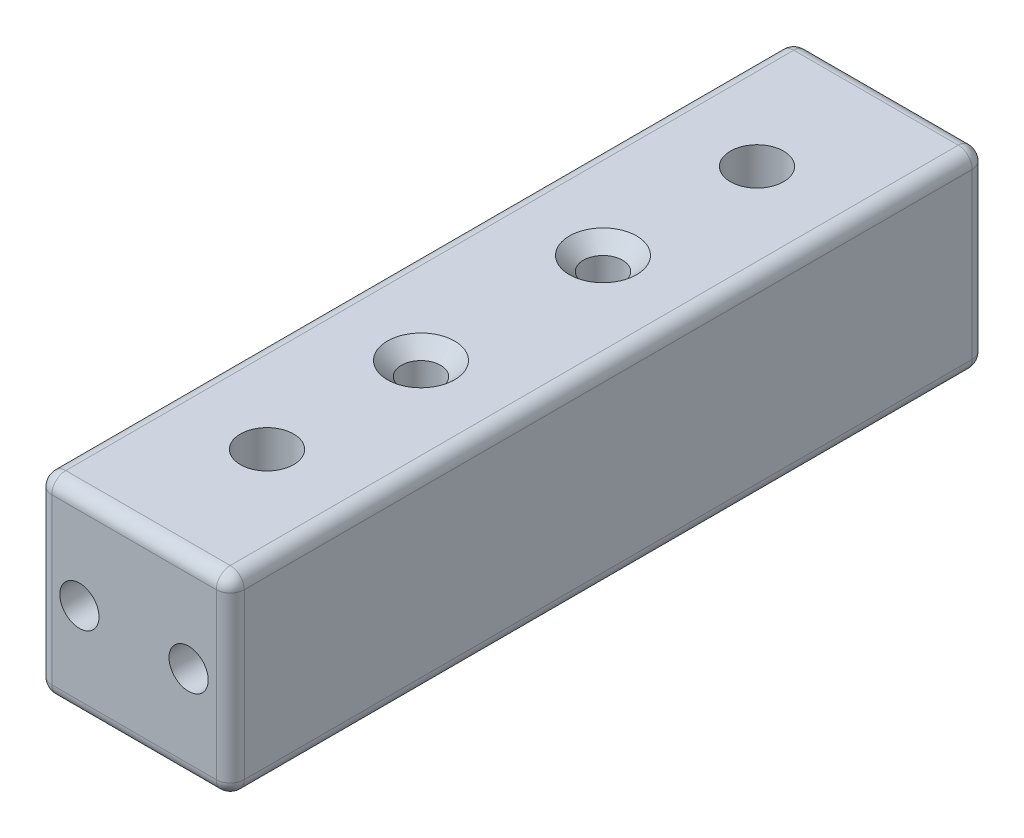
ISO-10303-21;
HEADER;
FILE_DESCRIPTION(('STEP AP214'),'2;1');
FILE_NAME('part.step','',(''),(''),'','','');
FILE_SCHEMA(('AUTOMOTIVE_DESIGN { 1 0 10303 214 1 1 1 1 }'));
ENDSEC;
DATA;
#1=APPLICATION_CONTEXT('core data for automotive mechanical design processes');
#2=APPLICATION_PROTOCOL_DEFINITION('international standard','automotive_design',2000,#1);
#3=PRODUCT_CONTEXT('',#1,'mechanical');
#4=PRODUCT('Part','Part','',(#3));
#5=PRODUCT_RELATED_PRODUCT_CATEGORY('part','',(#4));
#6=PRODUCT_DEFINITION_FORMATION('','',#4);
#7=PRODUCT_DEFINITION_CONTEXT('part definition',#1,'design');
#8=PRODUCT_DEFINITION('design','',#6,#7);
#9=PRODUCT_DEFINITION_SHAPE('','',#8);
#10=(LENGTH_UNIT() NAMED_UNIT(*) SI_UNIT(.MILLI.,.METRE.));
#11=(NAMED_UNIT(*) PLANE_ANGLE_UNIT() SI_UNIT($,.RADIAN.));
#12=(NAMED_UNIT(*) SI_UNIT($,.STERADIAN.) SOLID_ANGLE_UNIT());
#13=UNCERTAINTY_MEASURE_WITH_UNIT(LENGTH_MEASURE(1.E-05),#10,'distance_accuracy_value','');
#14=(GEOMETRIC_REPRESENTATION_CONTEXT(3) GLOBAL_UNCERTAINTY_ASSIGNED_CONTEXT((#13)) GLOBAL_UNIT_ASSIGNED_CONTEXT((#10,
#11,#12)) REPRESENTATION_CONTEXT('',''));
#15=CARTESIAN_POINT('',(0.,0.,0.));
#16=DIRECTION('',(0.,0.,1.));
#17=DIRECTION('',(1.,0.,0.));
#18=AXIS2_PLACEMENT_3D('',#15,#16,#17);
#19=CARTESIAN_POINT('',(6.875,-6.875,54.));
#20=DIRECTION('',(-1.,0.,0.));
#21=DIRECTION('',(0.,0.,1.));
#22=AXIS2_PLACEMENT_3D('',#19,#20,#21);
#23=PLANE('',#22);
#24=DIRECTION('',(0.,1.,0.));
#25=VECTOR('',#24,1.);
#26=CARTESIAN_POINT('',(6.875,-6.875,53.));
#27=LINE('',#26,#25);
#28=CARTESIAN_POINT('',(6.875,5.875,53.));
#29=VERTEX_POINT('',#28);
#30=CARTESIAN_POINT('',(6.875,-5.875,53.));
#31=VERTEX_POINT('',#30);
#32=EDGE_CURVE('E252',#29,#31,#27,.F.);
#33=ORIENTED_EDGE('',*,*,#32,.T.);
#34=DIRECTION('',(0.,0.,-1.));
#35=VECTOR('',#34,1.);
#36=CARTESIAN_POINT('',(6.875,-5.875,54.));
#37=LINE('',#36,#35);
#38=CARTESIAN_POINT('',(6.875,-5.875,1.));
#39=VERTEX_POINT('',#38);
#40=EDGE_CURVE('E259',#31,#39,#37,.T.);
#41=ORIENTED_EDGE('',*,*,#40,.T.);
#42=DIRECTION('',(0.,1.,0.));
#43=VECTOR('',#42,1.);
#44=CARTESIAN_POINT('',(6.875,6.875,1.));
#45=LINE('',#44,#43);
#46=CARTESIAN_POINT('',(6.875,5.875,1.));
#47=VERTEX_POINT('',#46);
#48=EDGE_CURVE('E255',#39,#47,#45,.T.);
#49=ORIENTED_EDGE('',*,*,#48,.T.);
#50=DIRECTION('',(0.,0.,-1.));
#51=VECTOR('',#50,1.);
#52=CARTESIAN_POINT('',(6.875,5.875,54.));
#53=LINE('',#52,#51);
#54=EDGE_CURVE('E249',#47,#29,#53,.F.);
#55=ORIENTED_EDGE('',*,*,#54,.T.);
#56=EDGE_LOOP('',(#33,#41,#49,#55));
#57=FACE_BOUND('',#56,.T.);
#58=ADVANCED_FACE('F50',(#57),#23,.F.);
#59=CARTESIAN_POINT('',(-6.875,6.875,54.));
#60=DIRECTION('',(0.,-1.,0.));
#61=DIRECTION('',(0.,0.,-1.));
#62=AXIS2_PLACEMENT_3D('',#59,#60,#61);
#63=PLANE('',#62);
#64=CARTESIAN_POINT('',(0.,6.875,33.5));
#65=DIRECTION('',(0.,-1.,0.));
#66=DIRECTION('',(0.,0.,-1.));
#67=AXIS2_PLACEMENT_3D('',#64,#65,#66);
#68=CIRCLE('',#67,2.4);
#69=CARTESIAN_POINT('',(0.,6.875,31.1));
#70=VERTEX_POINT('',#69);
#71=EDGE_CURVE('E11',#70,#70,#68,.T.);
#72=ORIENTED_EDGE('',*,*,#71,.T.);
#73=EDGE_LOOP('',(#72));
#74=FACE_BOUND('',#73,.T.);
#75=CARTESIAN_POINT('',(0.,6.875,20.5));
#76=DIRECTION('',(0.,-1.,0.));
#77=DIRECTION('',(0.,0.,-1.));
#78=AXIS2_PLACEMENT_3D('',#75,#76,#77);
#79=CIRCLE('',#78,2.4);
#80=CARTESIAN_POINT('',(0.,6.875,18.1));
#81=VERTEX_POINT('',#80);
#82=EDGE_CURVE('E60',#81,#81,#79,.T.);
#83=ORIENTED_EDGE('',*,*,#82,.T.);
#84=EDGE_LOOP('',(#83));
#85=FACE_BOUND('',#84,.T.);
#86=DIRECTION('',(-1.,0.,0.));
#87=VECTOR('',#86,1.);
#88=CARTESIAN_POINT('',(-6.875,6.875,53.));
#89=LINE('',#88,#87);
#90=CARTESIAN_POINT('',(-5.875,6.875,53.));
#91=VERTEX_POINT('',#90);
#92=CARTESIAN_POINT('',(5.875,6.875,53.));
#93=VERTEX_POINT('',#92);
#94=EDGE_CURVE('E196',#91,#93,#89,.F.);
#95=ORIENTED_EDGE('',*,*,#94,.T.);
#96=DIRECTION('',(0.,0.,-1.));
#97=VECTOR('',#96,1.);
#98=CARTESIAN_POINT('',(5.875,6.875,54.));
#99=LINE('',#98,#97);
#100=CARTESIAN_POINT('',(5.875,6.875,1.));
#101=VERTEX_POINT('',#100);
#102=EDGE_CURVE('E202',#93,#101,#99,.T.);
#103=ORIENTED_EDGE('',*,*,#102,.T.);
#104=DIRECTION('',(-1.,0.,0.));
#105=VECTOR('',#104,1.);
#106=CARTESIAN_POINT('',(-6.875,6.875,1.));
#107=LINE('',#106,#105);
#108=CARTESIAN_POINT('',(-5.875,6.875,1.));
#109=VERTEX_POINT('',#108);
#110=EDGE_CURVE('E169',#101,#109,#107,.T.);
#111=ORIENTED_EDGE('',*,*,#110,.T.);
#112=DIRECTION('',(0.,0.,-1.));
#113=VECTOR('',#112,1.);
#114=CARTESIAN_POINT('',(-5.875,6.875,54.));
#115=LINE('',#114,#113);
#116=EDGE_CURVE('E189',#109,#91,#115,.F.);
#117=ORIENTED_EDGE('',*,*,#116,.T.);
#118=EDGE_LOOP('',(#95,#103,#111,#117));
#119=FACE_BOUND('',#118,.T.);
#120=CARTESIAN_POINT('',(0.,6.875,9.5));
#121=DIRECTION('',(0.,1.,0.));
#122=DIRECTION('',(0.,0.,1.));
#123=AXIS2_PLACEMENT_3D('',#120,#121,#122);
#124=CIRCLE('',#123,1.9);
#125=CARTESIAN_POINT('',(0.,6.875,11.4));
#126=VERTEX_POINT('',#125);
#127=EDGE_CURVE('E876',#126,#126,#124,.T.);
#128=ORIENTED_EDGE('',*,*,#127,.F.);
#129=EDGE_LOOP('',(#128));
#130=FACE_BOUND('',#129,.T.);
#131=CARTESIAN_POINT('',(0.,6.875,44.5));
#132=DIRECTION('',(0.,1.,0.));
#133=DIRECTION('',(0.,0.,1.));
#134=AXIS2_PLACEMENT_3D('',#131,#132,#133);
#135=CIRCLE('',#134,1.9);
#136=CARTESIAN_POINT('',(0.,6.875,46.4));
#137=VERTEX_POINT('',#136);
#138=EDGE_CURVE('E866',#137,#137,#135,.T.);
#139=ORIENTED_EDGE('',*,*,#138,.F.);
#140=EDGE_LOOP('',(#139));
#141=FACE_BOUND('',#140,.T.);
#142=ADVANCED_FACE('F199',(#74,#85,#119,#130,#141),#63,.F.);
#143=CARTESIAN_POINT('',(-6.875,-6.875,54.));
#144=DIRECTION('',(1.,0.,0.));
#145=DIRECTION('',(0.,0.,-1.));
#146=AXIS2_PLACEMENT_3D('',#143,#144,#145);
#147=PLANE('',#146);
#148=DIRECTION('',(0.,-1.,0.));
#149=VECTOR('',#148,1.);
#150=CARTESIAN_POINT('',(-6.875,-6.875,1.));
#151=LINE('',#150,#149);
#152=CARTESIAN_POINT('',(-6.875,5.875,1.));
#153=VERTEX_POINT('',#152);
#154=CARTESIAN_POINT('',(-6.875,-5.875,1.));
#155=VERTEX_POINT('',#154);
#156=EDGE_CURVE('E229',#153,#155,#151,.T.);
#157=ORIENTED_EDGE('',*,*,#156,.T.);
#158=DIRECTION('',(0.,0.,-1.));
#159=VECTOR('',#158,1.);
#160=CARTESIAN_POINT('',(-6.875,-5.875,54.));
#161=LINE('',#160,#159);
#162=CARTESIAN_POINT('',(-6.875,-5.875,53.));
#163=VERTEX_POINT('',#162);
#164=EDGE_CURVE('E233',#155,#163,#161,.F.);
#165=ORIENTED_EDGE('',*,*,#164,.T.);
#166=DIRECTION('',(0.,-1.,0.));
#167=VECTOR('',#166,1.);
#168=CARTESIAN_POINT('',(-6.875,-6.875,53.));
#169=LINE('',#168,#167);
#170=CARTESIAN_POINT('',(-6.875,5.875,53.));
#171=VERTEX_POINT('',#170);
#172=EDGE_CURVE('E226',#163,#171,#169,.F.);
#173=ORIENTED_EDGE('',*,*,#172,.T.);
#174=DIRECTION('',(0.,0.,-1.));
#175=VECTOR('',#174,1.);
#176=CARTESIAN_POINT('',(-6.875,5.875,54.));
#177=LINE('',#176,#175);
#178=EDGE_CURVE('E223',#171,#153,#177,.T.);
#179=ORIENTED_EDGE('',*,*,#178,.T.);
#180=EDGE_LOOP('',(#157,#165,#173,#179));
#181=FACE_BOUND('',#180,.T.);
#182=ADVANCED_FACE('F403',(#181),#147,.F.);
#183=CARTESIAN_POINT('',(-6.875,-6.875,54.));
#184=DIRECTION('',(0.,1.,0.));
#185=DIRECTION('',(0.,0.,1.));
#186=AXIS2_PLACEMENT_3D('',#183,#184,#185);
#187=PLANE('',#186);
#188=CARTESIAN_POINT('',(0.,-6.875,20.5));
#189=DIRECTION('',(0.,1.,0.));
#190=DIRECTION('',(0.,0.,1.));
#191=AXIS2_PLACEMENT_3D('',#188,#189,#190);
#192=CIRCLE('',#191,2.39999999999999);
#193=CARTESIAN_POINT('',(0.,-6.875,22.9));
#194=VERTEX_POINT('',#193);
#195=EDGE_CURVE('E351',#194,#194,#192,.T.);
#196=ORIENTED_EDGE('',*,*,#195,.T.);
#197=EDGE_LOOP('',(#196));
#198=FACE_BOUND('',#197,.T.);
#199=CARTESIAN_POINT('',(0.,-6.875,33.5));
#200=DIRECTION('',(0.,1.,0.));
#201=DIRECTION('',(0.,0.,1.));
#202=AXIS2_PLACEMENT_3D('',#199,#200,#201);
#203=CIRCLE('',#202,2.39999999999999);
#204=CARTESIAN_POINT('',(0.,-6.875,35.9));
#205=VERTEX_POINT('',#204);
#206=EDGE_CURVE('E271',#205,#205,#203,.T.);
#207=ORIENTED_EDGE('',*,*,#206,.T.);
#208=EDGE_LOOP('',(#207));
#209=FACE_BOUND('',#208,.T.);
#210=DIRECTION('',(1.,0.,0.));
#211=VECTOR('',#210,1.);
#212=CARTESIAN_POINT('',(6.875,-6.875,1.));
#213=LINE('',#212,#211);
#214=CARTESIAN_POINT('',(-5.875,-6.875,1.));
#215=VERTEX_POINT('',#214);
#216=CARTESIAN_POINT('',(5.875,-6.875,1.));
#217=VERTEX_POINT('',#216);
#218=EDGE_CURVE('E242',#215,#217,#213,.T.);
#219=ORIENTED_EDGE('',*,*,#218,.T.);
#220=DIRECTION('',(0.,0.,-1.));
#221=VECTOR('',#220,1.);
#222=CARTESIAN_POINT('',(5.875,-6.875,54.));
#223=LINE('',#222,#221);
#224=CARTESIAN_POINT('',(5.875,-6.875,53.));
#225=VERTEX_POINT('',#224);
#226=EDGE_CURVE('E246',#217,#225,#223,.F.);
#227=ORIENTED_EDGE('',*,*,#226,.T.);
#228=DIRECTION('',(1.,0.,0.));
#229=VECTOR('',#228,1.);
#230=CARTESIAN_POINT('',(-6.875,-6.875,53.));
#231=LINE('',#230,#229);
#232=CARTESIAN_POINT('',(-5.875,-6.875,53.));
#233=VERTEX_POINT('',#232);
#234=EDGE_CURVE('E239',#225,#233,#231,.F.);
#235=ORIENTED_EDGE('',*,*,#234,.T.);
#236=DIRECTION('',(0.,0.,-1.));
#237=VECTOR('',#236,1.);
#238=CARTESIAN_POINT('',(-5.875,-6.875,54.));
#239=LINE('',#238,#237);
#240=EDGE_CURVE('E236',#233,#215,#239,.T.);
#241=ORIENTED_EDGE('',*,*,#240,.T.);
#242=EDGE_LOOP('',(#219,#227,#235,#241));
#243=FACE_BOUND('',#242,.T.);
#244=CARTESIAN_POINT('',(0.,-6.875,9.5));
#245=DIRECTION('',(0.,1.,0.));
#246=DIRECTION('',(0.,0.,1.));
#247=AXIS2_PLACEMENT_3D('',#244,#245,#246);
#248=CIRCLE('',#247,1.9);
#249=CARTESIAN_POINT('',(0.,-6.875,11.4));
#250=VERTEX_POINT('',#249);
#251=EDGE_CURVE('E197',#250,#250,#248,.T.);
#252=ORIENTED_EDGE('',*,*,#251,.T.);
#253=EDGE_LOOP('',(#252));
#254=FACE_BOUND('',#253,.T.);
#255=CARTESIAN_POINT('',(0.,-6.875,44.5));
#256=DIRECTION('',(0.,1.,0.));
#257=DIRECTION('',(0.,0.,1.));
#258=AXIS2_PLACEMENT_3D('',#255,#256,#257);
#259=CIRCLE('',#258,1.9);
#260=CARTESIAN_POINT('',(0.,-6.875,46.4));
#261=VERTEX_POINT('',#260);
#262=EDGE_CURVE('E861',#261,#261,#259,.T.);
#263=ORIENTED_EDGE('',*,*,#262,.T.);
#264=EDGE_LOOP('',(#263));
#265=FACE_BOUND('',#264,.T.);
#266=ADVANCED_FACE('F755',(#198,#209,#243,#254,#265),#187,.F.);
#267=CARTESIAN_POINT('',(0.,0.,54.));
#268=DIRECTION('',(0.,0.,-1.));
#269=DIRECTION('',(-1.,0.,0.));
#270=AXIS2_PLACEMENT_3D('',#267,#268,#269);
#271=PLANE('',#270);
#272=DIRECTION('',(0.,-1.,0.));
#273=VECTOR('',#272,1.);
#274=CARTESIAN_POINT('',(-5.875,0.,54.));
#275=LINE('',#274,#273);
#276=CARTESIAN_POINT('',(-5.875,5.875,54.));
#277=VERTEX_POINT('',#276);
#278=CARTESIAN_POINT('',(-5.875,-5.875,54.));
#279=VERTEX_POINT('',#278);
#280=EDGE_CURVE('E78',#277,#279,#275,.T.);
#281=ORIENTED_EDGE('',*,*,#280,.T.);
#282=DIRECTION('',(1.,0.,0.));
#283=VECTOR('',#282,1.);
#284=CARTESIAN_POINT('',(0.,-5.875,54.));
#285=LINE('',#284,#283);
#286=CARTESIAN_POINT('',(5.875,-5.875,54.));
#287=VERTEX_POINT('',#286);
#288=EDGE_CURVE('E269',#279,#287,#285,.T.);
#289=ORIENTED_EDGE('',*,*,#288,.T.);
#290=DIRECTION('',(0.,1.,0.));
#291=VECTOR('',#290,1.);
#292=CARTESIAN_POINT('',(5.875,0.,54.));
#293=LINE('',#292,#291);
#294=CARTESIAN_POINT('',(5.875,5.875,54.));
#295=VERTEX_POINT('',#294);
#296=EDGE_CURVE('E70',#287,#295,#293,.T.);
#297=ORIENTED_EDGE('',*,*,#296,.T.);
#298=DIRECTION('',(-1.,0.,0.));
#299=VECTOR('',#298,1.);
#300=CARTESIAN_POINT('',(0.,5.875,54.));
#301=LINE('',#300,#299);
#302=EDGE_CURVE('E262',#295,#277,#301,.T.);
#303=ORIENTED_EDGE('',*,*,#302,.T.);
#304=EDGE_LOOP('',(#281,#289,#297,#303));
#305=FACE_BOUND('',#304,.T.);
#306=CARTESIAN_POINT('',(-3.9,0.,54.));
#307=DIRECTION('',(0.,0.,1.));
#308=DIRECTION('',(1.,0.,0.));
#309=AXIS2_PLACEMENT_3D('',#306,#307,#308);
#310=CIRCLE('',#309,1.4);
#311=CARTESIAN_POINT('',(-2.5,0.,54.));
#312=VERTEX_POINT('',#311);
#313=EDGE_CURVE('E856',#312,#312,#310,.T.);
#314=ORIENTED_EDGE('',*,*,#313,.F.);
#315=EDGE_LOOP('',(#314));
#316=FACE_BOUND('',#315,.T.);
#317=CARTESIAN_POINT('',(3.9,0.,54.));
#318=DIRECTION('',(0.,0.,-1.));
#319=DIRECTION('',(-1.,0.,0.));
#320=AXIS2_PLACEMENT_3D('',#317,#318,#319);
#321=CIRCLE('',#320,1.4);
#322=CARTESIAN_POINT('',(2.5,0.,54.));
#323=VERTEX_POINT('',#322);
#324=EDGE_CURVE('E859',#323,#323,#321,.T.);
#325=ORIENTED_EDGE('',*,*,#324,.T.);
#326=EDGE_LOOP('',(#325));
#327=FACE_BOUND('',#326,.T.);
#328=ADVANCED_FACE('F393',(#305,#316,#327),#271,.F.);
#329=CARTESIAN_POINT('',(0.,0.,0.));
#330=DIRECTION('',(0.,0.,-1.));
#331=DIRECTION('',(-1.,0.,0.));
#332=AXIS2_PLACEMENT_3D('',#329,#330,#331);
#333=PLANE('',#332);
#334=DIRECTION('',(0.,-1.,0.));
#335=VECTOR('',#334,1.);
#336=CARTESIAN_POINT('',(-5.875,6.875,0.));
#337=LINE('',#336,#335);
#338=CARTESIAN_POINT('',(-5.875,-5.875,0.));
#339=VERTEX_POINT('',#338);
#340=CARTESIAN_POINT('',(-5.875,5.875,0.));
#341=VERTEX_POINT('',#340);
#342=EDGE_CURVE('E218',#339,#341,#337,.F.);
#343=ORIENTED_EDGE('',*,*,#342,.T.);
#344=DIRECTION('',(-1.,0.,0.));
#345=VECTOR('',#344,1.);
#346=CARTESIAN_POINT('',(6.875,5.875,0.));
#347=LINE('',#346,#345);
#348=CARTESIAN_POINT('',(5.875,5.875,0.));
#349=VERTEX_POINT('',#348);
#350=EDGE_CURVE('E171',#341,#349,#347,.F.);
#351=ORIENTED_EDGE('',*,*,#350,.T.);
#352=DIRECTION('',(0.,1.,0.));
#353=VECTOR('',#352,1.);
#354=CARTESIAN_POINT('',(5.875,-6.875,0.));
#355=LINE('',#354,#353);
#356=CARTESIAN_POINT('',(5.875,-5.875,0.));
#357=VERTEX_POINT('',#356);
#358=EDGE_CURVE('E208',#349,#357,#355,.F.);
#359=ORIENTED_EDGE('',*,*,#358,.T.);
#360=DIRECTION('',(1.,0.,0.));
#361=VECTOR('',#360,1.);
#362=CARTESIAN_POINT('',(-6.875,-5.875,0.));
#363=LINE('',#362,#361);
#364=EDGE_CURVE('E215',#357,#339,#363,.F.);
#365=ORIENTED_EDGE('',*,*,#364,.T.);
#366=EDGE_LOOP('',(#343,#351,#359,#365));
#367=FACE_BOUND('',#366,.T.);
#368=CARTESIAN_POINT('',(-3.9,0.,0.));
#369=DIRECTION('',(0.,0.,1.));
#370=DIRECTION('',(1.,0.,0.));
#371=AXIS2_PLACEMENT_3D('',#368,#369,#370);
#372=CIRCLE('',#371,1.4);
#373=CARTESIAN_POINT('',(-2.5,0.,0.));
#374=VERTEX_POINT('',#373);
#375=EDGE_CURVE('E347',#374,#374,#372,.T.);
#376=ORIENTED_EDGE('',*,*,#375,.T.);
#377=EDGE_LOOP('',(#376));
#378=FACE_BOUND('',#377,.T.);
#379=CARTESIAN_POINT('',(3.9,0.,0.));
#380=DIRECTION('',(0.,0.,-1.));
#381=DIRECTION('',(-1.,0.,0.));
#382=AXIS2_PLACEMENT_3D('',#379,#380,#381);
#383=CIRCLE('',#382,1.4);
#384=CARTESIAN_POINT('',(2.5,0.,0.));
#385=VERTEX_POINT('',#384);
#386=EDGE_CURVE('E862',#385,#385,#383,.T.);
#387=ORIENTED_EDGE('',*,*,#386,.F.);
#388=EDGE_LOOP('',(#387));
#389=FACE_BOUND('',#388,.T.);
#390=ADVANCED_FACE('F383',(#367,#378,#389),#333,.T.);
#391=CARTESIAN_POINT('',(0.,-6.875,20.5));
#392=DIRECTION('',(0.,1.,0.));
#393=DIRECTION('',(0.,0.,1.));
#394=AXIS2_PLACEMENT_3D('',#391,#392,#393);
#395=CYLINDRICAL_SURFACE('',#394,1.4);
#396=CARTESIAN_POINT('',(0.,-5.87500000000001,20.5));
#397=DIRECTION('',(0.,1.,0.));
#398=DIRECTION('',(0.,0.,1.));
#399=AXIS2_PLACEMENT_3D('',#396,#397,#398);
#400=CIRCLE('',#399,1.4);
#401=CARTESIAN_POINT('',(0.,-5.87500000000001,21.9));
#402=VERTEX_POINT('',#401);
#403=EDGE_CURVE('E359',#402,#402,#400,.F.);
#404=ORIENTED_EDGE('',*,*,#403,.T.);
#405=EDGE_LOOP('',(#404));
#406=FACE_BOUND('',#405,.T.);
#407=CARTESIAN_POINT('',(0.,5.87500000000001,20.5));
#408=DIRECTION('',(0.,-1.,0.));
#409=DIRECTION('',(0.,0.,-1.));
#410=AXIS2_PLACEMENT_3D('',#407,#408,#409);
#411=CIRCLE('',#410,1.4);
#412=CARTESIAN_POINT('',(0.,5.87500000000001,19.1));
#413=VERTEX_POINT('',#412);
#414=EDGE_CURVE('E355',#413,#413,#411,.F.);
#415=ORIENTED_EDGE('',*,*,#414,.T.);
#416=EDGE_LOOP('',(#415));
#417=FACE_BOUND('',#416,.T.);
#418=ADVANCED_FACE('F380',(#406,#417),#395,.F.);
#419=CARTESIAN_POINT('',(0.,-6.875,33.5));
#420=DIRECTION('',(0.,1.,0.));
#421=DIRECTION('',(0.,0.,1.));
#422=AXIS2_PLACEMENT_3D('',#419,#420,#421);
#423=CYLINDRICAL_SURFACE('',#422,1.4);
#424=CARTESIAN_POINT('',(0.,-5.875,33.5));
#425=DIRECTION('',(0.,1.,0.));
#426=DIRECTION('',(0.,0.,1.));
#427=AXIS2_PLACEMENT_3D('',#424,#425,#426);
#428=CIRCLE('',#427,1.4);
#429=CARTESIAN_POINT('',(0.,-5.875,34.9));
#430=VERTEX_POINT('',#429);
#431=EDGE_CURVE('E367',#430,#430,#428,.F.);
#432=ORIENTED_EDGE('',*,*,#431,.T.);
#433=EDGE_LOOP('',(#432));
#434=FACE_BOUND('',#433,.T.);
#435=CARTESIAN_POINT('',(0.,5.87500000000001,33.5));
#436=DIRECTION('',(0.,-1.,0.));
#437=DIRECTION('',(0.,0.,-1.));
#438=AXIS2_PLACEMENT_3D('',#435,#436,#437);
#439=CIRCLE('',#438,1.4);
#440=CARTESIAN_POINT('',(0.,5.87500000000001,32.1));
#441=VERTEX_POINT('',#440);
#442=EDGE_CURVE('E363',#441,#441,#439,.F.);
#443=ORIENTED_EDGE('',*,*,#442,.T.);
#444=EDGE_LOOP('',(#443));
#445=FACE_BOUND('',#444,.T.);
#446=ADVANCED_FACE('F382',(#434,#445),#423,.F.);
#447=CARTESIAN_POINT('',(0.,-6.875,44.5));
#448=DIRECTION('',(0.,1.,0.));
#449=DIRECTION('',(0.,0.,1.));
#450=AXIS2_PLACEMENT_3D('',#447,#448,#449);
#451=CYLINDRICAL_SURFACE('',#450,1.9);
#452=ORIENTED_EDGE('',*,*,#262,.F.);
#453=EDGE_LOOP('',(#452));
#454=FACE_BOUND('',#453,.T.);
#455=ORIENTED_EDGE('',*,*,#138,.T.);
#456=EDGE_LOOP('',(#455));
#457=FACE_BOUND('',#456,.T.);
#458=ADVANCED_FACE('F390',(#454,#457),#451,.F.);
#459=CARTESIAN_POINT('',(0.,-6.875,9.5));
#460=DIRECTION('',(0.,1.,0.));
#461=DIRECTION('',(0.,0.,1.));
#462=AXIS2_PLACEMENT_3D('',#459,#460,#461);
#463=CYLINDRICAL_SURFACE('',#462,1.9);
#464=ORIENTED_EDGE('',*,*,#251,.F.);
#465=EDGE_LOOP('',(#464));
#466=FACE_BOUND('',#465,.T.);
#467=ORIENTED_EDGE('',*,*,#127,.T.);
#468=EDGE_LOOP('',(#467));
#469=FACE_BOUND('',#468,.T.);
#470=ADVANCED_FACE('F702',(#466,#469),#463,.F.);
#471=CARTESIAN_POINT('',(3.9,0.,54.));
#472=DIRECTION('',(0.,0.,-1.));
#473=DIRECTION('',(-1.,0.,0.));
#474=AXIS2_PLACEMENT_3D('',#471,#472,#473);
#475=CYLINDRICAL_SURFACE('',#474,1.4);
#476=ORIENTED_EDGE('',*,*,#324,.F.);
#477=EDGE_LOOP('',(#476));
#478=FACE_BOUND('',#477,.T.);
#479=ORIENTED_EDGE('',*,*,#386,.T.);
#480=EDGE_LOOP('',(#479));
#481=FACE_BOUND('',#480,.T.);
#482=ADVANCED_FACE('F689',(#478,#481),#475,.F.);
#483=CARTESIAN_POINT('',(-3.9,0.,54.));
#484=DIRECTION('',(0.,0.,-1.));
#485=DIRECTION('',(-1.,0.,0.));
#486=AXIS2_PLACEMENT_3D('',#483,#484,#485);
#487=CYLINDRICAL_SURFACE('',#486,1.4);
#488=ORIENTED_EDGE('',*,*,#313,.T.);
#489=EDGE_LOOP('',(#488));
#490=FACE_BOUND('',#489,.T.);
#491=ORIENTED_EDGE('',*,*,#375,.F.);
#492=EDGE_LOOP('',(#491));
#493=FACE_BOUND('',#492,.T.);
#494=ADVANCED_FACE('F481',(#490,#493),#487,.F.);
#495=CARTESIAN_POINT('',(0.,-5.875,53.));
#496=DIRECTION('',(1.,0.,0.));
#497=DIRECTION('',(0.,0.,-1.));
#498=AXIS2_PLACEMENT_3D('',#495,#496,#497);
#499=CYLINDRICAL_SURFACE('',#498,1.);
#500=CARTESIAN_POINT('',(5.875,-5.875,53.));
#501=DIRECTION('',(1.,0.,0.));
#502=DIRECTION('',(0.,0.,-1.));
#503=AXIS2_PLACEMENT_3D('',#500,#501,#502);
#504=CIRCLE('',#503,1.);
#505=EDGE_CURVE('E343',#287,#225,#504,.T.);
#506=ORIENTED_EDGE('',*,*,#505,.F.);
#507=ORIENTED_EDGE('',*,*,#288,.F.);
#508=CARTESIAN_POINT('',(-5.875,-5.875,53.));
#509=DIRECTION('',(-1.,0.,0.));
#510=DIRECTION('',(0.,0.,1.));
#511=AXIS2_PLACEMENT_3D('',#508,#509,#510);
#512=CIRCLE('',#511,1.);
#513=EDGE_CURVE('E340',#233,#279,#512,.T.);
#514=ORIENTED_EDGE('',*,*,#513,.F.);
#515=ORIENTED_EDGE('',*,*,#234,.F.);
#516=EDGE_LOOP('',(#506,#507,#514,#515));
#517=FACE_BOUND('',#516,.T.);
#518=ADVANCED_FACE('F477',(#517),#499,.T.);
#519=CARTESIAN_POINT('',(5.875,-5.875,53.));
#520=DIRECTION('',(0.,-1.,0.));
#521=DIRECTION('',(0.,0.,-1.));
#522=AXIS2_PLACEMENT_3D('',#519,#520,#521);
#523=SPHERICAL_SURFACE('',#522,1.);
#524=CARTESIAN_POINT('',(5.875,-5.875,53.));
#525=DIRECTION('',(0.,-1.,0.));
#526=DIRECTION('',(0.,0.,-1.));
#527=AXIS2_PLACEMENT_3D('',#524,#525,#526);
#528=CIRCLE('',#527,1.);
#529=EDGE_CURVE('E333',#287,#31,#528,.F.);
#530=ORIENTED_EDGE('',*,*,#529,.F.);
#531=ORIENTED_EDGE('',*,*,#505,.T.);
#532=CARTESIAN_POINT('',(5.875,-5.875,53.));
#533=DIRECTION('',(0.,0.,1.));
#534=DIRECTION('',(1.,0.,0.));
#535=AXIS2_PLACEMENT_3D('',#532,#533,#534);
#536=CIRCLE('',#535,1.);
#537=EDGE_CURVE('E336',#31,#225,#536,.F.);
#538=ORIENTED_EDGE('',*,*,#537,.F.);
#539=EDGE_LOOP('',(#530,#531,#538));
#540=FACE_BOUND('',#539,.T.);
#541=ADVANCED_FACE('F473',(#540),#523,.T.);
#542=CARTESIAN_POINT('',(-5.875,-5.875,53.));
#543=DIRECTION('',(0.,0.,1.));
#544=DIRECTION('',(1.,0.,0.));
#545=AXIS2_PLACEMENT_3D('',#542,#543,#544);
#546=SPHERICAL_SURFACE('',#545,1.);
#547=CARTESIAN_POINT('',(-5.875,-5.875,53.));
#548=DIRECTION('',(0.,0.,1.));
#549=DIRECTION('',(1.,0.,0.));
#550=AXIS2_PLACEMENT_3D('',#547,#548,#549);
#551=CIRCLE('',#550,1.);
#552=EDGE_CURVE('E327',#233,#163,#551,.F.);
#553=ORIENTED_EDGE('',*,*,#552,.F.);
#554=ORIENTED_EDGE('',*,*,#513,.T.);
#555=CARTESIAN_POINT('',(-5.875,-5.875,53.));
#556=DIRECTION('',(0.,-1.,0.));
#557=DIRECTION('',(0.,0.,-1.));
#558=AXIS2_PLACEMENT_3D('',#555,#556,#557);
#559=CIRCLE('',#558,1.);
#560=EDGE_CURVE('E330',#163,#279,#559,.F.);
#561=ORIENTED_EDGE('',*,*,#560,.F.);
#562=EDGE_LOOP('',(#553,#554,#561));
#563=FACE_BOUND('',#562,.T.);
#564=ADVANCED_FACE('F469',(#563),#546,.T.);
#565=CARTESIAN_POINT('',(5.875,-5.875,54.));
#566=DIRECTION('',(0.,0.,-1.));
#567=DIRECTION('',(-1.,0.,0.));
#568=AXIS2_PLACEMENT_3D('',#565,#566,#567);
#569=CYLINDRICAL_SURFACE('',#568,1.);
#570=ORIENTED_EDGE('',*,*,#537,.T.);
#571=ORIENTED_EDGE('',*,*,#226,.F.);
#572=CARTESIAN_POINT('',(5.875,-5.875,1.));
#573=DIRECTION('',(0.,0.,-1.));
#574=DIRECTION('',(-1.,0.,0.));
#575=AXIS2_PLACEMENT_3D('',#572,#573,#574);
#576=CIRCLE('',#575,1.);
#577=EDGE_CURVE('E320',#39,#217,#576,.T.);
#578=ORIENTED_EDGE('',*,*,#577,.F.);
#579=ORIENTED_EDGE('',*,*,#40,.F.);
#580=EDGE_LOOP('',(#570,#571,#578,#579));
#581=FACE_BOUND('',#580,.T.);
#582=ADVANCED_FACE('F466',(#581),#569,.T.);
#583=CARTESIAN_POINT('',(5.875,0.,53.));
#584=DIRECTION('',(0.,1.,0.));
#585=DIRECTION('',(0.,0.,1.));
#586=AXIS2_PLACEMENT_3D('',#583,#584,#585);
#587=CYLINDRICAL_SURFACE('',#586,1.);
#588=ORIENTED_EDGE('',*,*,#529,.T.);
#589=ORIENTED_EDGE('',*,*,#32,.F.);
#590=CARTESIAN_POINT('',(5.875,5.875,53.));
#591=DIRECTION('',(0.,1.,0.));
#592=DIRECTION('',(0.,0.,1.));
#593=AXIS2_PLACEMENT_3D('',#590,#591,#592);
#594=CIRCLE('',#593,1.);
#595=EDGE_CURVE('E316',#295,#29,#594,.T.);
#596=ORIENTED_EDGE('',*,*,#595,.F.);
#597=ORIENTED_EDGE('',*,*,#296,.F.);
#598=EDGE_LOOP('',(#588,#589,#596,#597));
#599=FACE_BOUND('',#598,.T.);
#600=ADVANCED_FACE('F462',(#599),#587,.T.);
#601=CARTESIAN_POINT('',(0.,5.875,53.));
#602=DIRECTION('',(-1.,0.,0.));
#603=DIRECTION('',(0.,0.,1.));
#604=AXIS2_PLACEMENT_3D('',#601,#602,#603);
#605=CYLINDRICAL_SURFACE('',#604,1.);
#606=CARTESIAN_POINT('',(-5.875,5.875,53.));
#607=DIRECTION('',(-1.,0.,0.));
#608=DIRECTION('',(0.,0.,1.));
#609=AXIS2_PLACEMENT_3D('',#606,#607,#608);
#610=CIRCLE('',#609,1.);
#611=EDGE_CURVE('E308',#277,#91,#610,.T.);
#612=ORIENTED_EDGE('',*,*,#611,.F.);
#613=ORIENTED_EDGE('',*,*,#302,.F.);
#614=CARTESIAN_POINT('',(5.875,5.875,53.));
#615=DIRECTION('',(1.,0.,0.));
#616=DIRECTION('',(0.,0.,-1.));
#617=AXIS2_PLACEMENT_3D('',#614,#615,#616);
#618=CIRCLE('',#617,1.);
#619=EDGE_CURVE('E312',#93,#295,#618,.T.);
#620=ORIENTED_EDGE('',*,*,#619,.F.);
#621=ORIENTED_EDGE('',*,*,#94,.F.);
#622=EDGE_LOOP('',(#612,#613,#620,#621));
#623=FACE_BOUND('',#622,.T.);
#624=ADVANCED_FACE('F458',(#623),#605,.T.);
#625=CARTESIAN_POINT('',(-5.875,0.,53.));
#626=DIRECTION('',(0.,-1.,0.));
#627=DIRECTION('',(0.,0.,-1.));
#628=AXIS2_PLACEMENT_3D('',#625,#626,#627);
#629=CYLINDRICAL_SURFACE('',#628,1.);
#630=ORIENTED_EDGE('',*,*,#560,.T.);
#631=ORIENTED_EDGE('',*,*,#280,.F.);
#632=CARTESIAN_POINT('',(-5.875,5.875,53.));
#633=DIRECTION('',(0.,1.,0.));
#634=DIRECTION('',(0.,0.,1.));
#635=AXIS2_PLACEMENT_3D('',#632,#633,#634);
#636=CIRCLE('',#635,1.);
#637=EDGE_CURVE('E304',#171,#277,#636,.T.);
#638=ORIENTED_EDGE('',*,*,#637,.F.);
#639=ORIENTED_EDGE('',*,*,#172,.F.);
#640=EDGE_LOOP('',(#630,#631,#638,#639));
#641=FACE_BOUND('',#640,.T.);
#642=ADVANCED_FACE('F454',(#641),#629,.T.);
#643=CARTESIAN_POINT('',(-5.875,-5.875,54.));
#644=DIRECTION('',(0.,0.,-1.));
#645=DIRECTION('',(-1.,0.,0.));
#646=AXIS2_PLACEMENT_3D('',#643,#644,#645);
#647=CYLINDRICAL_SURFACE('',#646,1.);
#648=ORIENTED_EDGE('',*,*,#552,.T.);
#649=ORIENTED_EDGE('',*,*,#164,.F.);
#650=CARTESIAN_POINT('',(-5.875,-5.875,1.));
#651=DIRECTION('',(0.,0.,-1.));
#652=DIRECTION('',(-1.,0.,0.));
#653=AXIS2_PLACEMENT_3D('',#650,#651,#652);
#654=CIRCLE('',#653,1.);
#655=EDGE_CURVE('E300',#215,#155,#654,.T.);
#656=ORIENTED_EDGE('',*,*,#655,.F.);
#657=ORIENTED_EDGE('',*,*,#240,.F.);
#658=EDGE_LOOP('',(#648,#649,#656,#657));
#659=FACE_BOUND('',#658,.T.);
#660=ADVANCED_FACE('F450',(#659),#647,.T.);
#661=CARTESIAN_POINT('',(-6.875,-5.875,1.));
#662=DIRECTION('',(-1.,0.,0.));
#663=DIRECTION('',(0.,0.,1.));
#664=AXIS2_PLACEMENT_3D('',#661,#662,#663);
#665=CYLINDRICAL_SURFACE('',#664,1.);
#666=CARTESIAN_POINT('',(5.875,-5.875,1.));
#667=DIRECTION('',(1.,0.,0.));
#668=DIRECTION('',(0.,0.,-1.));
#669=AXIS2_PLACEMENT_3D('',#666,#667,#668);
#670=CIRCLE('',#669,1.);
#671=EDGE_CURVE('E323',#217,#357,#670,.T.);
#672=ORIENTED_EDGE('',*,*,#671,.F.);
#673=ORIENTED_EDGE('',*,*,#218,.F.);
#674=CARTESIAN_POINT('',(-5.875,-5.875,1.));
#675=DIRECTION('',(-1.,0.,0.));
#676=DIRECTION('',(0.,0.,1.));
#677=AXIS2_PLACEMENT_3D('',#674,#675,#676);
#678=CIRCLE('',#677,1.);
#679=EDGE_CURVE('E296',#339,#215,#678,.T.);
#680=ORIENTED_EDGE('',*,*,#679,.F.);
#681=ORIENTED_EDGE('',*,*,#364,.F.);
#682=EDGE_LOOP('',(#672,#673,#680,#681));
#683=FACE_BOUND('',#682,.T.);
#684=ADVANCED_FACE('F446',(#683),#665,.T.);
#685=CARTESIAN_POINT('',(5.875,-5.875,1.));
#686=DIRECTION('',(0.,-1.,0.));
#687=DIRECTION('',(0.,0.,-1.));
#688=AXIS2_PLACEMENT_3D('',#685,#686,#687);
#689=SPHERICAL_SURFACE('',#688,1.);
#690=ORIENTED_EDGE('',*,*,#577,.T.);
#691=ORIENTED_EDGE('',*,*,#671,.T.);
#692=CARTESIAN_POINT('',(5.875,-5.875,1.));
#693=DIRECTION('',(0.,-1.,0.));
#694=DIRECTION('',(0.,0.,-1.));
#695=AXIS2_PLACEMENT_3D('',#692,#693,#694);
#696=CIRCLE('',#695,1.);
#697=EDGE_CURVE('E292',#39,#357,#696,.F.);
#698=ORIENTED_EDGE('',*,*,#697,.F.);
#699=EDGE_LOOP('',(#690,#691,#698));
#700=FACE_BOUND('',#699,.T.);
#701=ADVANCED_FACE('F442',(#700),#689,.T.);
#702=CARTESIAN_POINT('',(5.875,5.875,53.));
#703=DIRECTION('',(0.,0.,1.));
#704=DIRECTION('',(1.,0.,0.));
#705=AXIS2_PLACEMENT_3D('',#702,#703,#704);
#706=SPHERICAL_SURFACE('',#705,1.);
#707=ORIENTED_EDGE('',*,*,#619,.T.);
#708=ORIENTED_EDGE('',*,*,#595,.T.);
#709=CARTESIAN_POINT('',(5.875,5.875,53.));
#710=DIRECTION('',(0.,0.,1.));
#711=DIRECTION('',(1.,0.,0.));
#712=AXIS2_PLACEMENT_3D('',#709,#710,#711);
#713=CIRCLE('',#712,1.);
#714=EDGE_CURVE('E288',#93,#29,#713,.F.);
#715=ORIENTED_EDGE('',*,*,#714,.F.);
#716=EDGE_LOOP('',(#707,#708,#715));
#717=FACE_BOUND('',#716,.T.);
#718=ADVANCED_FACE('F438',(#717),#706,.T.);
#719=CARTESIAN_POINT('',(-5.875,5.875,53.));
#720=DIRECTION('',(0.,0.,1.));
#721=DIRECTION('',(1.,0.,0.));
#722=AXIS2_PLACEMENT_3D('',#719,#720,#721);
#723=SPHERICAL_SURFACE('',#722,1.);
#724=ORIENTED_EDGE('',*,*,#637,.T.);
#725=ORIENTED_EDGE('',*,*,#611,.T.);
#726=CARTESIAN_POINT('',(-5.875,5.875,53.));
#727=DIRECTION('',(0.,0.,1.));
#728=DIRECTION('',(1.,0.,0.));
#729=AXIS2_PLACEMENT_3D('',#726,#727,#728);
#730=CIRCLE('',#729,1.);
#731=EDGE_CURVE('E192',#171,#91,#730,.F.);
#732=ORIENTED_EDGE('',*,*,#731,.F.);
#733=EDGE_LOOP('',(#724,#725,#732));
#734=FACE_BOUND('',#733,.T.);
#735=ADVANCED_FACE('F434',(#734),#723,.T.);
#736=CARTESIAN_POINT('',(-5.875,-5.875,1.));
#737=DIRECTION('',(0.,-1.,0.));
#738=DIRECTION('',(0.,0.,-1.));
#739=AXIS2_PLACEMENT_3D('',#736,#737,#738);
#740=SPHERICAL_SURFACE('',#739,1.);
#741=ORIENTED_EDGE('',*,*,#679,.T.);
#742=ORIENTED_EDGE('',*,*,#655,.T.);
#743=CARTESIAN_POINT('',(-5.875,-5.875,1.));
#744=DIRECTION('',(0.,-1.,0.));
#745=DIRECTION('',(0.,0.,-1.));
#746=AXIS2_PLACEMENT_3D('',#743,#744,#745);
#747=CIRCLE('',#746,1.);
#748=EDGE_CURVE('E283',#339,#155,#747,.F.);
#749=ORIENTED_EDGE('',*,*,#748,.F.);
#750=EDGE_LOOP('',(#741,#742,#749));
#751=FACE_BOUND('',#750,.T.);
#752=ADVANCED_FACE('F430',(#751),#740,.T.);
#753=CARTESIAN_POINT('',(5.875,-6.875,1.));
#754=DIRECTION('',(0.,-1.,0.));
#755=DIRECTION('',(0.,0.,-1.));
#756=AXIS2_PLACEMENT_3D('',#753,#754,#755);
#757=CYLINDRICAL_SURFACE('',#756,1.);
#758=ORIENTED_EDGE('',*,*,#697,.T.);
#759=ORIENTED_EDGE('',*,*,#358,.F.);
#760=CARTESIAN_POINT('',(5.875,5.875,1.));
#761=DIRECTION('',(0.,1.,0.));
#762=DIRECTION('',(0.,0.,1.));
#763=AXIS2_PLACEMENT_3D('',#760,#761,#762);
#764=CIRCLE('',#763,1.);
#765=EDGE_CURVE('E279',#47,#349,#764,.T.);
#766=ORIENTED_EDGE('',*,*,#765,.F.);
#767=ORIENTED_EDGE('',*,*,#48,.F.);
#768=EDGE_LOOP('',(#758,#759,#766,#767));
#769=FACE_BOUND('',#768,.T.);
#770=ADVANCED_FACE('F426',(#769),#757,.T.);
#771=CARTESIAN_POINT('',(5.875,5.875,54.));
#772=DIRECTION('',(0.,0.,-1.));
#773=DIRECTION('',(-1.,0.,0.));
#774=AXIS2_PLACEMENT_3D('',#771,#772,#773);
#775=CYLINDRICAL_SURFACE('',#774,1.);
#776=ORIENTED_EDGE('',*,*,#714,.T.);
#777=ORIENTED_EDGE('',*,*,#54,.F.);
#778=CARTESIAN_POINT('',(5.875,5.875,1.));
#779=DIRECTION('',(0.,0.,-1.));
#780=DIRECTION('',(-1.,0.,0.));
#781=AXIS2_PLACEMENT_3D('',#778,#779,#780);
#782=CIRCLE('',#781,1.);
#783=EDGE_CURVE('E186',#101,#47,#782,.T.);
#784=ORIENTED_EDGE('',*,*,#783,.F.);
#785=ORIENTED_EDGE('',*,*,#102,.F.);
#786=EDGE_LOOP('',(#776,#777,#784,#785));
#787=FACE_BOUND('',#786,.T.);
#788=ADVANCED_FACE('F423',(#787),#775,.T.);
#789=CARTESIAN_POINT('',(-5.875,5.875,54.));
#790=DIRECTION('',(0.,0.,-1.));
#791=DIRECTION('',(-1.,0.,0.));
#792=AXIS2_PLACEMENT_3D('',#789,#790,#791);
#793=CYLINDRICAL_SURFACE('',#792,1.);
#794=ORIENTED_EDGE('',*,*,#731,.T.);
#795=ORIENTED_EDGE('',*,*,#116,.F.);
#796=CARTESIAN_POINT('',(-5.875,5.875,1.));
#797=DIRECTION('',(0.,0.,-1.));
#798=DIRECTION('',(-1.,0.,0.));
#799=AXIS2_PLACEMENT_3D('',#796,#797,#798);
#800=CIRCLE('',#799,1.);
#801=EDGE_CURVE('E178',#153,#109,#800,.T.);
#802=ORIENTED_EDGE('',*,*,#801,.F.);
#803=ORIENTED_EDGE('',*,*,#178,.F.);
#804=EDGE_LOOP('',(#794,#795,#802,#803));
#805=FACE_BOUND('',#804,.T.);
#806=ADVANCED_FACE('F190',(#805),#793,.T.);
#807=CARTESIAN_POINT('',(-5.875,-6.875,1.));
#808=DIRECTION('',(0.,1.,0.));
#809=DIRECTION('',(0.,0.,1.));
#810=AXIS2_PLACEMENT_3D('',#807,#808,#809);
#811=CYLINDRICAL_SURFACE('',#810,1.);
#812=ORIENTED_EDGE('',*,*,#748,.T.);
#813=ORIENTED_EDGE('',*,*,#156,.F.);
#814=CARTESIAN_POINT('',(-5.875,5.875,1.));
#815=DIRECTION('',(0.,1.,0.));
#816=DIRECTION('',(0.,0.,1.));
#817=AXIS2_PLACEMENT_3D('',#814,#815,#816);
#818=CIRCLE('',#817,1.);
#819=EDGE_CURVE('E182',#341,#153,#818,.T.);
#820=ORIENTED_EDGE('',*,*,#819,.F.);
#821=ORIENTED_EDGE('',*,*,#342,.F.);
#822=EDGE_LOOP('',(#812,#813,#820,#821));
#823=FACE_BOUND('',#822,.T.);
#824=ADVANCED_FACE('F416',(#823),#811,.T.);
#825=CARTESIAN_POINT('',(5.875,5.875,1.));
#826=DIRECTION('',(1.,0.,0.));
#827=DIRECTION('',(0.,0.,-1.));
#828=AXIS2_PLACEMENT_3D('',#825,#826,#827);
#829=SPHERICAL_SURFACE('',#828,1.);
#830=ORIENTED_EDGE('',*,*,#783,.T.);
#831=ORIENTED_EDGE('',*,*,#765,.T.);
#832=CARTESIAN_POINT('',(5.875,5.875,1.));
#833=DIRECTION('',(1.,0.,0.));
#834=DIRECTION('',(0.,0.,-1.));
#835=AXIS2_PLACEMENT_3D('',#832,#833,#834);
#836=CIRCLE('',#835,1.);
#837=EDGE_CURVE('E175',#101,#349,#836,.F.);
#838=ORIENTED_EDGE('',*,*,#837,.F.);
#839=EDGE_LOOP('',(#830,#831,#838));
#840=FACE_BOUND('',#839,.T.);
#841=ADVANCED_FACE('F413',(#840),#829,.T.);
#842=CARTESIAN_POINT('',(-5.875,5.875,1.));
#843=DIRECTION('',(-1.,0.,0.));
#844=DIRECTION('',(0.,0.,1.));
#845=AXIS2_PLACEMENT_3D('',#842,#843,#844);
#846=SPHERICAL_SURFACE('',#845,1.);
#847=ORIENTED_EDGE('',*,*,#819,.T.);
#848=ORIENTED_EDGE('',*,*,#801,.T.);
#849=CARTESIAN_POINT('',(-5.875,5.875,1.));
#850=DIRECTION('',(-1.,0.,0.));
#851=DIRECTION('',(0.,0.,1.));
#852=AXIS2_PLACEMENT_3D('',#849,#850,#851);
#853=CIRCLE('',#852,1.);
#854=EDGE_CURVE('E165',#341,#109,#853,.F.);
#855=ORIENTED_EDGE('',*,*,#854,.F.);
#856=EDGE_LOOP('',(#847,#848,#855));
#857=FACE_BOUND('',#856,.T.);
#858=ADVANCED_FACE('F180',(#857),#846,.T.);
#859=CARTESIAN_POINT('',(-6.875,5.875,1.));
#860=DIRECTION('',(1.,0.,0.));
#861=DIRECTION('',(0.,0.,-1.));
#862=AXIS2_PLACEMENT_3D('',#859,#860,#861);
#863=CYLINDRICAL_SURFACE('',#862,1.);
#864=ORIENTED_EDGE('',*,*,#837,.T.);
#865=ORIENTED_EDGE('',*,*,#350,.F.);
#866=ORIENTED_EDGE('',*,*,#854,.T.);
#867=ORIENTED_EDGE('',*,*,#110,.F.);
#868=EDGE_LOOP('',(#864,#865,#866,#867));
#869=FACE_BOUND('',#868,.T.);
#870=ADVANCED_FACE('F167',(#869),#863,.T.);
#871=CARTESIAN_POINT('',(0.,-6.875,20.5));
#872=DIRECTION('',(0.,-1.,0.));
#873=DIRECTION('',(0.,0.,-1.));
#874=AXIS2_PLACEMENT_3D('',#871,#872,#873);
#875=CONICAL_SURFACE('',#874,2.39999999999999,0.785398163397444);
#876=ORIENTED_EDGE('',*,*,#403,.F.);
#877=EDGE_LOOP('',(#876));
#878=FACE_BOUND('',#877,.T.);
#879=ORIENTED_EDGE('',*,*,#195,.F.);
#880=EDGE_LOOP('',(#879));
#881=FACE_BOUND('',#880,.T.);
#882=ADVANCED_FACE('F410',(#878,#881),#875,.F.);
#883=CARTESIAN_POINT('',(0.,-6.875,33.5));
#884=DIRECTION('',(0.,-1.,0.));
#885=DIRECTION('',(0.,0.,-1.));
#886=AXIS2_PLACEMENT_3D('',#883,#884,#885);
#887=CONICAL_SURFACE('',#886,2.39999999999999,0.785398163397442);
#888=ORIENTED_EDGE('',*,*,#431,.F.);
#889=EDGE_LOOP('',(#888));
#890=FACE_BOUND('',#889,.T.);
#891=ORIENTED_EDGE('',*,*,#206,.F.);
#892=EDGE_LOOP('',(#891));
#893=FACE_BOUND('',#892,.T.);
#894=ADVANCED_FACE('F489',(#890,#893),#887,.F.);
#895=CARTESIAN_POINT('',(0.,5.87500000000001,33.5));
#896=DIRECTION('',(0.,1.,0.));
#897=DIRECTION('',(0.,0.,1.));
#898=AXIS2_PLACEMENT_3D('',#895,#896,#897);
#899=CONICAL_SURFACE('',#898,1.4,0.785398163397452);
#900=ORIENTED_EDGE('',*,*,#71,.F.);
#901=EDGE_LOOP('',(#900));
#902=FACE_BOUND('',#901,.T.);
#903=ORIENTED_EDGE('',*,*,#442,.F.);
#904=EDGE_LOOP('',(#903));
#905=FACE_BOUND('',#904,.T.);
#906=ADVANCED_FACE('F377',(#902,#905),#899,.F.);
#907=CARTESIAN_POINT('',(0.,5.87500000000001,20.5));
#908=DIRECTION('',(0.,1.,0.));
#909=DIRECTION('',(0.,0.,1.));
#910=AXIS2_PLACEMENT_3D('',#907,#908,#909);
#911=CONICAL_SURFACE('',#910,1.4,0.785398163397453);
#912=ORIENTED_EDGE('',*,*,#82,.F.);
#913=EDGE_LOOP('',(#912));
#914=FACE_BOUND('',#913,.T.);
#915=ORIENTED_EDGE('',*,*,#414,.F.);
#916=EDGE_LOOP('',(#915));
#917=FACE_BOUND('',#916,.T.);
#918=ADVANCED_FACE('F53',(#914,#917),#911,.F.);
#919=CLOSED_SHELL('',(#58,#142,#182,#266,#328,#390,#418,#446,#458,#470,#482,#494,#518,#541,#564,
#582,#600,#624,#642,#660,#684,#701,#718,#735,#752,#770,#788,#806,#824,#841,#858,#870,#882,#894,
#906,#918));
#920=MANIFOLD_SOLID_BREP('B2',#919);
#921=ADVANCED_BREP_SHAPE_REPRESENTATION('',(#18,#920),#14);
#922=SHAPE_DEFINITION_REPRESENTATION(#9,#921);
ENDSEC;
END-ISO-10303-21;
